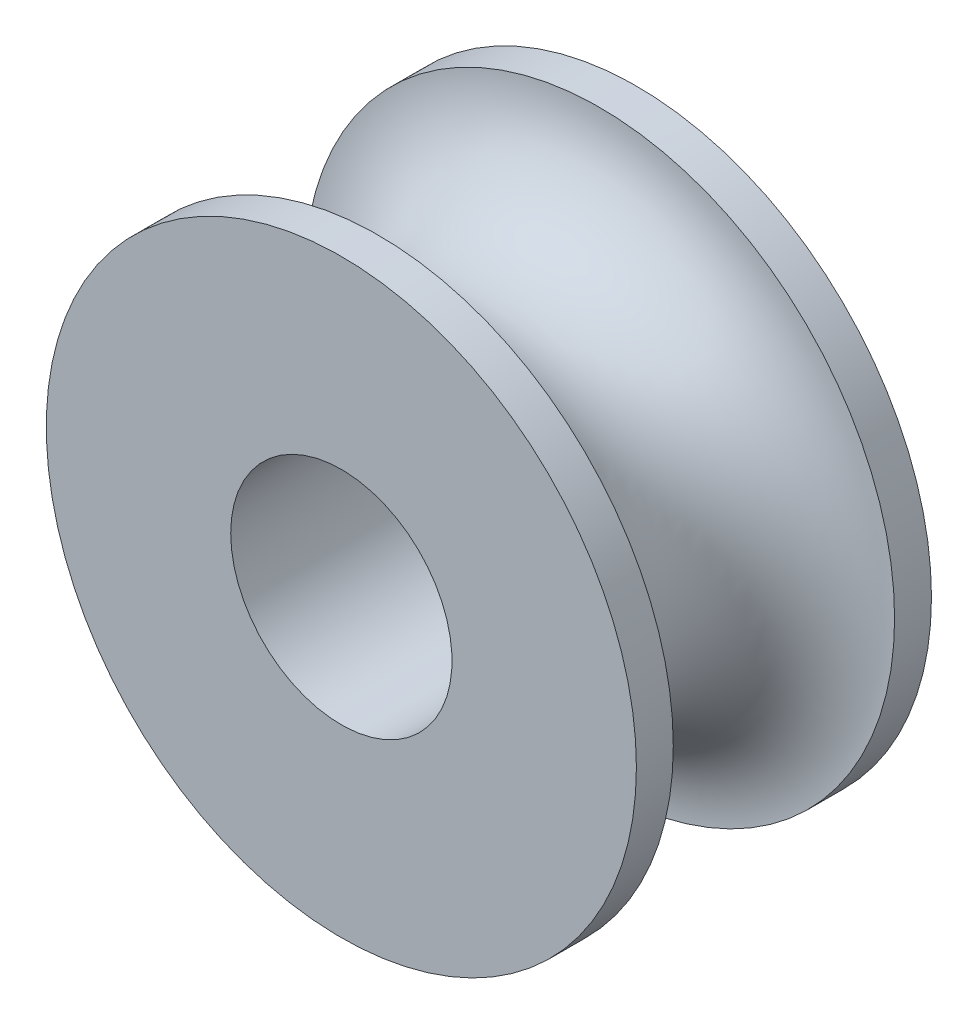
ISO-10303-21;
HEADER;
FILE_DESCRIPTION(('STEP AP214'),'2;1');
FILE_NAME('part.step','',(''),(''),'','','');
FILE_SCHEMA(('AUTOMOTIVE_DESIGN { 1 0 10303 214 1 1 1 1 }'));
ENDSEC;
DATA;
#1=APPLICATION_CONTEXT('core data for automotive mechanical design processes');
#2=APPLICATION_PROTOCOL_DEFINITION('international standard','automotive_design',2000,#1);
#3=PRODUCT_CONTEXT('',#1,'mechanical');
#4=PRODUCT('Part','Part','',(#3));
#5=PRODUCT_RELATED_PRODUCT_CATEGORY('part','',(#4));
#6=PRODUCT_DEFINITION_FORMATION('','',#4);
#7=PRODUCT_DEFINITION_CONTEXT('part definition',#1,'design');
#8=PRODUCT_DEFINITION('design','',#6,#7);
#9=PRODUCT_DEFINITION_SHAPE('','',#8);
#10=(LENGTH_UNIT() NAMED_UNIT(*) SI_UNIT(.MILLI.,.METRE.));
#11=(NAMED_UNIT(*) PLANE_ANGLE_UNIT() SI_UNIT($,.RADIAN.));
#12=(NAMED_UNIT(*) SI_UNIT($,.STERADIAN.) SOLID_ANGLE_UNIT());
#13=UNCERTAINTY_MEASURE_WITH_UNIT(LENGTH_MEASURE(1.E-05),#10,'distance_accuracy_value','');
#14=(GEOMETRIC_REPRESENTATION_CONTEXT(3) GLOBAL_UNCERTAINTY_ASSIGNED_CONTEXT((#13)) GLOBAL_UNIT_ASSIGNED_CONTEXT((#10,
#11,#12)) REPRESENTATION_CONTEXT('',''));
#15=CARTESIAN_POINT('',(0.,0.,0.));
#16=DIRECTION('',(0.,0.,1.));
#17=DIRECTION('',(1.,0.,0.));
#18=AXIS2_PLACEMENT_3D('',#15,#16,#17);
#19=CARTESIAN_POINT('',(0.,0.,25.4));
#20=DIRECTION('',(0.,0.,-1.));
#21=DIRECTION('',(-1.,0.,0.));
#22=AXIS2_PLACEMENT_3D('',#19,#20,#21);
#23=CYLINDRICAL_SURFACE('',#22,25.4);
#24=CARTESIAN_POINT('',(0.,0.,22.225));
#25=DIRECTION('',(0.,0.,1.));
#26=DIRECTION('',(1.,0.,0.));
#27=AXIS2_PLACEMENT_3D('',#24,#25,#26);
#28=CIRCLE('',#27,25.4);
#29=CARTESIAN_POINT('',(25.4,0.,22.225));
#30=VERTEX_POINT('',#29);
#31=EDGE_CURVE('E50',#30,#30,#28,.T.);
#32=ORIENTED_EDGE('',*,*,#31,.T.);
#33=EDGE_LOOP('',(#32));
#34=FACE_BOUND('',#33,.T.);
#35=CARTESIAN_POINT('',(0.,0.,25.4));
#36=DIRECTION('',(0.,0.,1.));
#37=DIRECTION('',(1.,0.,0.));
#38=AXIS2_PLACEMENT_3D('',#35,#36,#37);
#39=CIRCLE('',#38,25.4);
#40=CARTESIAN_POINT('',(25.4,0.,25.4));
#41=VERTEX_POINT('',#40);
#42=EDGE_CURVE('E10',#41,#41,#39,.T.);
#43=ORIENTED_EDGE('',*,*,#42,.F.);
#44=EDGE_LOOP('',(#43));
#45=FACE_BOUND('',#44,.T.);
#46=ADVANCED_FACE('F37',(#34,#45),#23,.T.);
#47=CARTESIAN_POINT('',(0.,0.,25.4));
#48=DIRECTION('',(0.,0.,1.));
#49=DIRECTION('',(1.,0.,0.));
#50=AXIS2_PLACEMENT_3D('',#47,#48,#49);
#51=PLANE('',#50);
#52=CARTESIAN_POINT('',(0.,0.,25.4));
#53=DIRECTION('',(0.,0.,-1.));
#54=DIRECTION('',(-1.,0.,0.));
#55=AXIS2_PLACEMENT_3D('',#52,#53,#54);
#56=CIRCLE('',#55,9.525);
#57=CARTESIAN_POINT('',(-9.525,0.,25.4));
#58=VERTEX_POINT('',#57);
#59=EDGE_CURVE('E59',#58,#58,#56,.T.);
#60=ORIENTED_EDGE('',*,*,#59,.T.);
#61=EDGE_LOOP('',(#60));
#62=FACE_BOUND('',#61,.T.);
#63=ORIENTED_EDGE('',*,*,#42,.T.);
#64=EDGE_LOOP('',(#63));
#65=FACE_BOUND('',#64,.T.);
#66=ADVANCED_FACE('F68',(#62,#65),#51,.T.);
#67=CARTESIAN_POINT('',(0.,0.,12.7));
#68=DIRECTION('',(0.,0.,1.));
#69=DIRECTION('',(1.,0.,0.));
#70=AXIS2_PLACEMENT_3D('',#67,#68,#69);
#71=TOROIDAL_SURFACE('',#70,25.4,9.525);
#72=ORIENTED_EDGE('',*,*,#31,.F.);
#73=EDGE_LOOP('',(#72));
#74=FACE_BOUND('',#73,.T.);
#75=CARTESIAN_POINT('',(0.,0.,3.175));
#76=DIRECTION('',(0.,0.,1.));
#77=DIRECTION('',(1.,0.,0.));
#78=AXIS2_PLACEMENT_3D('',#75,#76,#77);
#79=CIRCLE('',#78,25.4);
#80=CARTESIAN_POINT('',(25.4,0.,3.175));
#81=VERTEX_POINT('',#80);
#82=EDGE_CURVE('E55',#81,#81,#79,.T.);
#83=ORIENTED_EDGE('',*,*,#82,.T.);
#84=EDGE_LOOP('',(#83));
#85=FACE_BOUND('',#84,.T.);
#86=ADVANCED_FACE('F79',(#74,#85),#71,.F.);
#87=CARTESIAN_POINT('',(0.,0.,0.));
#88=DIRECTION('',(0.,0.,1.));
#89=DIRECTION('',(1.,0.,0.));
#90=AXIS2_PLACEMENT_3D('',#87,#88,#89);
#91=PLANE('',#90);
#92=CARTESIAN_POINT('',(0.,0.,0.));
#93=DIRECTION('',(0.,0.,-1.));
#94=DIRECTION('',(-1.,0.,0.));
#95=AXIS2_PLACEMENT_3D('',#92,#93,#94);
#96=CIRCLE('',#95,9.525);
#97=CARTESIAN_POINT('',(-9.525,0.,0.));
#98=VERTEX_POINT('',#97);
#99=EDGE_CURVE('E60',#98,#98,#96,.T.);
#100=ORIENTED_EDGE('',*,*,#99,.F.);
#101=EDGE_LOOP('',(#100));
#102=FACE_BOUND('',#101,.T.);
#103=CARTESIAN_POINT('',(0.,0.,0.));
#104=DIRECTION('',(0.,0.,1.));
#105=DIRECTION('',(1.,0.,0.));
#106=AXIS2_PLACEMENT_3D('',#103,#104,#105);
#107=CIRCLE('',#106,25.4);
#108=CARTESIAN_POINT('',(25.4,0.,0.));
#109=VERTEX_POINT('',#108);
#110=EDGE_CURVE('E41',#109,#109,#107,.T.);
#111=ORIENTED_EDGE('',*,*,#110,.F.);
#112=EDGE_LOOP('',(#111));
#113=FACE_BOUND('',#112,.T.);
#114=ADVANCED_FACE('F76',(#102,#113),#91,.F.);
#115=ORIENTED_EDGE('',*,*,#82,.F.);
#116=EDGE_LOOP('',(#115));
#117=FACE_BOUND('',#116,.T.);
#118=ORIENTED_EDGE('',*,*,#110,.T.);
#119=EDGE_LOOP('',(#118));
#120=FACE_BOUND('',#119,.T.);
#121=ADVANCED_FACE('F39',(#117,#120),#23,.T.);
#122=CARTESIAN_POINT('',(0.,0.,25.4));
#123=DIRECTION('',(0.,0.,-1.));
#124=DIRECTION('',(-1.,0.,0.));
#125=AXIS2_PLACEMENT_3D('',#122,#123,#124);
#126=CYLINDRICAL_SURFACE('',#125,9.525);
#127=ORIENTED_EDGE('',*,*,#59,.F.);
#128=EDGE_LOOP('',(#127));
#129=FACE_BOUND('',#128,.T.);
#130=ORIENTED_EDGE('',*,*,#99,.T.);
#131=EDGE_LOOP('',(#130));
#132=FACE_BOUND('',#131,.T.);
#133=ADVANCED_FACE('F70',(#129,#132),#126,.F.);
#134=CLOSED_SHELL('',(#46,#66,#86,#114,#121,#133));
#135=MANIFOLD_SOLID_BREP('B2',#134);
#136=ADVANCED_BREP_SHAPE_REPRESENTATION('',(#18,#135),#14);
#137=SHAPE_DEFINITION_REPRESENTATION(#9,#136);
ENDSEC;
END-ISO-10303-21;
